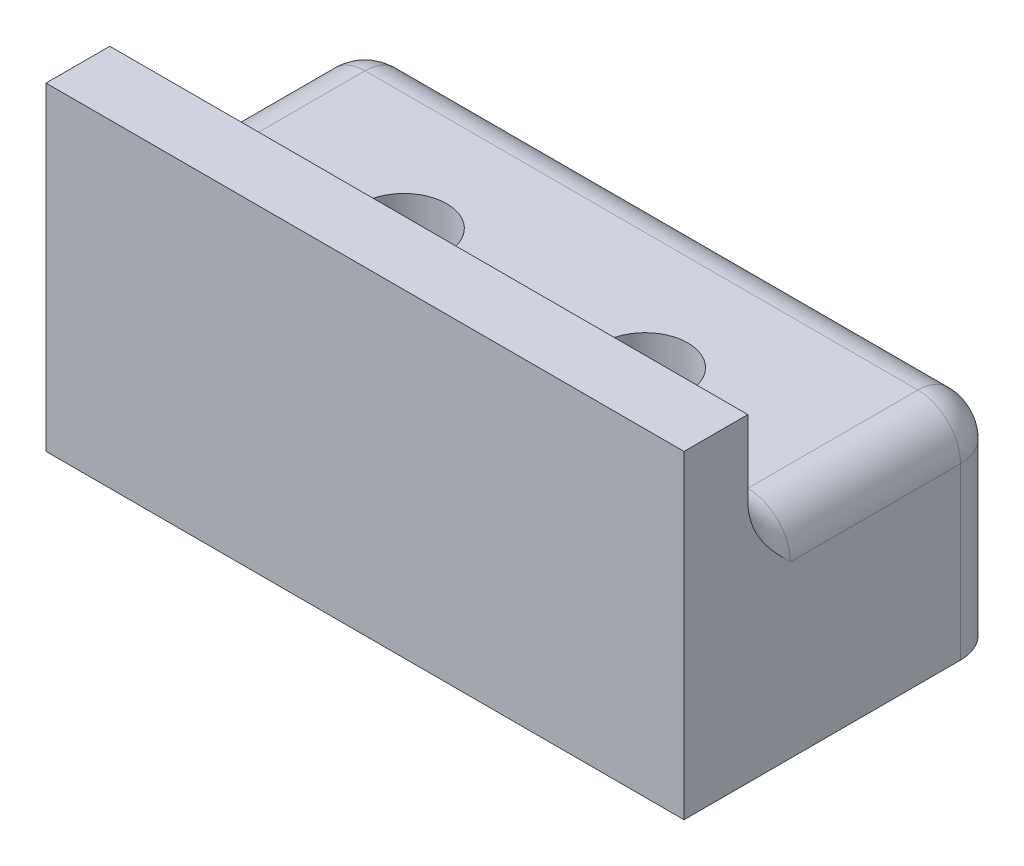
ISO-10303-21;
HEADER;
FILE_DESCRIPTION(('STEP AP214'),'2;1');
FILE_NAME('part.step','',(''),(''),'','','');
FILE_SCHEMA(('AUTOMOTIVE_DESIGN { 1 0 10303 214 1 1 1 1 }'));
ENDSEC;
DATA;
#1=APPLICATION_CONTEXT('core data for automotive mechanical design processes');
#2=APPLICATION_PROTOCOL_DEFINITION('international standard','automotive_design',2000,#1);
#3=PRODUCT_CONTEXT('',#1,'mechanical');
#4=PRODUCT('Part','Part','',(#3));
#5=PRODUCT_RELATED_PRODUCT_CATEGORY('part','',(#4));
#6=PRODUCT_DEFINITION_FORMATION('','',#4);
#7=PRODUCT_DEFINITION_CONTEXT('part definition',#1,'design');
#8=PRODUCT_DEFINITION('design','',#6,#7);
#9=PRODUCT_DEFINITION_SHAPE('','',#8);
#10=(LENGTH_UNIT() NAMED_UNIT(*) SI_UNIT(.MILLI.,.METRE.));
#11=(NAMED_UNIT(*) PLANE_ANGLE_UNIT() SI_UNIT($,.RADIAN.));
#12=(NAMED_UNIT(*) SI_UNIT($,.STERADIAN.) SOLID_ANGLE_UNIT());
#13=UNCERTAINTY_MEASURE_WITH_UNIT(LENGTH_MEASURE(1.E-05),#10,'distance_accuracy_value','');
#14=(GEOMETRIC_REPRESENTATION_CONTEXT(3) GLOBAL_UNCERTAINTY_ASSIGNED_CONTEXT((#13)) GLOBAL_UNIT_ASSIGNED_CONTEXT((#10,
#11,#12)) REPRESENTATION_CONTEXT('',''));
#15=CARTESIAN_POINT('',(0.,0.,0.));
#16=DIRECTION('',(0.,0.,1.));
#17=DIRECTION('',(1.,0.,0.));
#18=AXIS2_PLACEMENT_3D('',#15,#16,#17);
#19=CARTESIAN_POINT('',(0.,12.7,0.));
#20=DIRECTION('',(0.,-1.,0.));
#21=DIRECTION('',(0.,0.,-1.));
#22=AXIS2_PLACEMENT_3D('',#19,#20,#21);
#23=PLANE('',#22);
#24=DIRECTION('',(0.,0.,1.));
#25=VECTOR('',#24,1.);
#26=CARTESIAN_POINT('',(-16.51,12.7,0.));
#27=LINE('',#26,#25);
#28=CARTESIAN_POINT('',(-16.51,12.7,-6.985));
#29=VERTEX_POINT('',#28);
#30=CARTESIAN_POINT('',(-16.51,12.7,3.175));
#31=VERTEX_POINT('',#30);
#32=EDGE_CURVE('E190',#29,#31,#27,.T.);
#33=ORIENTED_EDGE('',*,*,#32,.T.);
#34=DIRECTION('',(-1.,0.,0.));
#35=VECTOR('',#34,1.);
#36=CARTESIAN_POINT('',(16.51,12.7,3.175));
#37=LINE('',#36,#35);
#38=CARTESIAN_POINT('',(16.51,12.7,3.175));
#39=VERTEX_POINT('',#38);
#40=EDGE_CURVE('E237',#31,#39,#37,.F.);
#41=ORIENTED_EDGE('',*,*,#40,.T.);
#42=DIRECTION('',(0.,0.,-1.));
#43=VECTOR('',#42,1.);
#44=CARTESIAN_POINT('',(16.51,12.7,0.));
#45=LINE('',#44,#43);
#46=CARTESIAN_POINT('',(16.51,12.7,-6.985));
#47=VERTEX_POINT('',#46);
#48=EDGE_CURVE('E192',#39,#47,#45,.T.);
#49=ORIENTED_EDGE('',*,*,#48,.T.);
#50=DIRECTION('',(-1.,0.,0.));
#51=VECTOR('',#50,1.);
#52=CARTESIAN_POINT('',(0.,12.7,-6.985));
#53=LINE('',#52,#51);
#54=EDGE_CURVE('E139',#47,#29,#53,.T.);
#55=ORIENTED_EDGE('',*,*,#54,.T.);
#56=EDGE_LOOP('',(#33,#41,#49,#55));
#57=FACE_BOUND('',#56,.T.);
#58=CARTESIAN_POINT('',(-7.2009,12.7,0.));
#59=DIRECTION('',(0.,1.,0.));
#60=DIRECTION('',(0.,0.,-1.));
#61=AXIS2_PLACEMENT_3D('',#58,#59,#60);
#62=CIRCLE('',#61,2.5527);
#63=CARTESIAN_POINT('',(-7.2009,12.7,-2.5527));
#64=VERTEX_POINT('',#63);
#65=EDGE_CURVE('E168',#64,#64,#62,.T.);
#66=ORIENTED_EDGE('',*,*,#65,.F.);
#67=EDGE_LOOP('',(#66));
#68=FACE_BOUND('',#67,.T.);
#69=CARTESIAN_POINT('',(7.2009,12.7,0.));
#70=DIRECTION('',(0.,1.,0.));
#71=DIRECTION('',(0.,0.,1.));
#72=AXIS2_PLACEMENT_3D('',#69,#70,#71);
#73=CIRCLE('',#72,2.5527);
#74=CARTESIAN_POINT('',(7.2009,12.7,2.5527));
#75=VERTEX_POINT('',#74);
#76=EDGE_CURVE('E174',#75,#75,#73,.T.);
#77=ORIENTED_EDGE('',*,*,#76,.F.);
#78=EDGE_LOOP('',(#77));
#79=FACE_BOUND('',#78,.T.);
#80=ADVANCED_FACE('F39',(#57,#68,#79),#23,.F.);
#81=CARTESIAN_POINT('',(0.,0.,0.));
#82=DIRECTION('',(0.,-1.,0.));
#83=DIRECTION('',(0.,0.,-1.));
#84=AXIS2_PLACEMENT_3D('',#81,#82,#83);
#85=PLANE('',#84);
#86=CARTESIAN_POINT('',(7.2009,0.,0.));
#87=DIRECTION('',(0.,1.,0.));
#88=DIRECTION('',(0.,0.,1.));
#89=AXIS2_PLACEMENT_3D('',#86,#87,#88);
#90=CIRCLE('',#89,2.5527);
#91=CARTESIAN_POINT('',(7.2009,0.,2.5527));
#92=VERTEX_POINT('',#91);
#93=EDGE_CURVE('E171',#92,#92,#90,.T.);
#94=ORIENTED_EDGE('',*,*,#93,.T.);
#95=EDGE_LOOP('',(#94));
#96=FACE_BOUND('',#95,.T.);
#97=DIRECTION('',(0.,0.,1.));
#98=VECTOR('',#97,1.);
#99=CARTESIAN_POINT('',(-19.05,0.,9.525));
#100=LINE('',#99,#98);
#101=CARTESIAN_POINT('',(-19.05,0.,-6.98499999999999));
#102=VERTEX_POINT('',#101);
#103=CARTESIAN_POINT('',(-19.05,0.,9.525));
#104=VERTEX_POINT('',#103);
#105=EDGE_CURVE('E136',#102,#104,#100,.T.);
#106=ORIENTED_EDGE('',*,*,#105,.F.);
#107=CARTESIAN_POINT('',(-16.51,0.,-6.985));
#108=DIRECTION('',(0.,-1.,0.));
#109=DIRECTION('',(0.,0.,-1.));
#110=AXIS2_PLACEMENT_3D('',#107,#108,#109);
#111=CIRCLE('',#110,2.54);
#112=CARTESIAN_POINT('',(-16.51,0.,-9.525));
#113=VERTEX_POINT('',#112);
#114=EDGE_CURVE('E205',#102,#113,#111,.T.);
#115=ORIENTED_EDGE('',*,*,#114,.T.);
#116=DIRECTION('',(-1.,0.,0.));
#117=VECTOR('',#116,1.);
#118=CARTESIAN_POINT('',(-19.05,0.,-9.525));
#119=LINE('',#118,#117);
#120=CARTESIAN_POINT('',(16.51,0.,-9.525));
#121=VERTEX_POINT('',#120);
#122=EDGE_CURVE('E182',#121,#113,#119,.T.);
#123=ORIENTED_EDGE('',*,*,#122,.F.);
#124=CARTESIAN_POINT('',(16.51,0.,-6.985));
#125=DIRECTION('',(0.,-1.,0.));
#126=DIRECTION('',(0.,0.,-1.));
#127=AXIS2_PLACEMENT_3D('',#124,#125,#126);
#128=CIRCLE('',#127,2.54);
#129=CARTESIAN_POINT('',(19.05,0.,-6.98499999999999));
#130=VERTEX_POINT('',#129);
#131=EDGE_CURVE('E203',#121,#130,#128,.T.);
#132=ORIENTED_EDGE('',*,*,#131,.T.);
#133=DIRECTION('',(0.,0.,-1.));
#134=VECTOR('',#133,1.);
#135=CARTESIAN_POINT('',(19.05,0.,9.525));
#136=LINE('',#135,#134);
#137=CARTESIAN_POINT('',(19.05,0.,9.525));
#138=VERTEX_POINT('',#137);
#139=EDGE_CURVE('E177',#138,#130,#136,.T.);
#140=ORIENTED_EDGE('',*,*,#139,.F.);
#141=DIRECTION('',(1.,0.,0.));
#142=VECTOR('',#141,1.);
#143=CARTESIAN_POINT('',(-19.05,0.,9.525));
#144=LINE('',#143,#142);
#145=EDGE_CURVE('E186',#104,#138,#144,.T.);
#146=ORIENTED_EDGE('',*,*,#145,.F.);
#147=EDGE_LOOP('',(#106,#115,#123,#132,#140,#146));
#148=FACE_BOUND('',#147,.T.);
#149=CARTESIAN_POINT('',(-7.2009,0.,0.));
#150=DIRECTION('',(0.,1.,0.));
#151=DIRECTION('',(0.,0.,-1.));
#152=AXIS2_PLACEMENT_3D('',#149,#150,#151);
#153=CIRCLE('',#152,2.5527);
#154=CARTESIAN_POINT('',(-7.2009,0.,-2.5527));
#155=VERTEX_POINT('',#154);
#156=EDGE_CURVE('E167',#155,#155,#153,.T.);
#157=ORIENTED_EDGE('',*,*,#156,.T.);
#158=EDGE_LOOP('',(#157));
#159=FACE_BOUND('',#158,.T.);
#160=ADVANCED_FACE('F259',(#96,#148,#159),#85,.T.);
#161=CARTESIAN_POINT('',(19.05,12.7,9.525));
#162=DIRECTION('',(-1.,0.,0.));
#163=DIRECTION('',(0.,0.,1.));
#164=AXIS2_PLACEMENT_3D('',#161,#162,#163);
#165=PLANE('',#164);
#166=DIRECTION('',(0.,0.,-1.));
#167=VECTOR('',#166,1.);
#168=CARTESIAN_POINT('',(19.05,10.16,9.525));
#169=LINE('',#168,#167);
#170=CARTESIAN_POINT('',(19.05,10.16,-6.985));
#171=VERTEX_POINT('',#170);
#172=CARTESIAN_POINT('',(19.05,10.16,3.175));
#173=VERTEX_POINT('',#172);
#174=EDGE_CURVE('E196',#171,#173,#169,.F.);
#175=ORIENTED_EDGE('',*,*,#174,.T.);
#176=CARTESIAN_POINT('',(19.05,14.5594090512249,5.715));
#177=CARTESIAN_POINT('',(19.05,14.4505759874427,5.71501504876247));
#178=CARTESIAN_POINT('',(19.05,14.3418065232302,5.70975624543979));
#179=CARTESIAN_POINT('',(19.05,14.1253476567874,5.68941322800302));
#180=CARTESIAN_POINT('',(19.05,14.0176568637444,5.67434396617409));
#181=CARTESIAN_POINT('',(19.05,13.8052595388879,5.63533444604275));
#182=CARTESIAN_POINT('',(19.05,13.7005326849799,5.61150324095517));
#183=CARTESIAN_POINT('',(19.05,13.4932406471553,5.55569268019696));
#184=CARTESIAN_POINT('',(19.05,13.3906765212546,5.52370943224836));
#185=CARTESIAN_POINT('',(19.05,13.1505102847445,5.43909624670696));
#186=CARTESIAN_POINT('',(19.05,13.0140509102258,5.38321046532352));
#187=CARTESIAN_POINT('',(19.05,12.7465998736406,5.25951996810727));
#188=CARTESIAN_POINT('',(19.05,12.6156126892767,5.19170571919607));
#189=CARTESIAN_POINT('',(19.05,12.230098360125,4.97263734949868));
#190=CARTESIAN_POINT('',(19.05,11.9841881684873,4.8061998794252));
#191=CARTESIAN_POINT('',(19.05,11.4639726646023,4.41027580909795));
#192=CARTESIAN_POINT('',(19.05,11.1943668281642,4.17487297354857));
#193=CARTESIAN_POINT('',(19.05,10.6721911833007,3.6870318111219));
#194=CARTESIAN_POINT('',(19.05,10.4196083228355,3.43460683970978));
#195=CARTESIAN_POINT('',(19.05,10.1647516058492,3.17975160571443));
#196=CARTESIAN_POINT('',(19.05,10.1623758018692,3.17737580170878));
#197=CARTESIAN_POINT('',(19.05,10.16,3.175));
#198=B_SPLINE_CURVE_WITH_KNOTS('',3,(#176,#177,#178,#179,#180,#181,#182,#183,#184,#185,#186,
#187,#188,#189,#190,#191,#192,#193,#194,#195,#196,#197),.UNSPECIFIED.,.F.,.F.,(4,2,2,2,2,2,2,2,
2,2,4),(0.,0.326279030100379,0.652061933370734,0.973920224726877,1.2959324794988,
1.73760545667784,2.17963303041169,3.06739378455278,4.13940698375844,5.2105886598945,
5.22066834243601),.UNSPECIFIED.);
#199=CARTESIAN_POINT('',(19.05,14.5594090512249,5.715));
#200=VERTEX_POINT('',#199);
#201=EDGE_CURVE('E49',#173,#200,#198,.F.);
#202=ORIENTED_EDGE('',*,*,#201,.T.);
#203=DIRECTION('',(0.,-1.,0.));
#204=VECTOR('',#203,1.);
#205=CARTESIAN_POINT('',(19.05,19.05,5.715));
#206=LINE('',#205,#204);
#207=CARTESIAN_POINT('',(19.05,19.05,5.715));
#208=VERTEX_POINT('',#207);
#209=EDGE_CURVE('E164',#208,#200,#206,.T.);
#210=ORIENTED_EDGE('',*,*,#209,.F.);
#211=DIRECTION('',(0.,0.,-1.));
#212=VECTOR('',#211,1.);
#213=CARTESIAN_POINT('',(19.05,19.05,5.715));
#214=LINE('',#213,#212);
#215=CARTESIAN_POINT('',(19.05,19.05,9.525));
#216=VERTEX_POINT('',#215);
#217=EDGE_CURVE('E148',#216,#208,#214,.T.);
#218=ORIENTED_EDGE('',*,*,#217,.F.);
#219=DIRECTION('',(0.,-1.,0.));
#220=VECTOR('',#219,1.);
#221=CARTESIAN_POINT('',(19.05,12.7,9.525));
#222=LINE('',#221,#220);
#223=EDGE_CURVE('E140',#216,#138,#222,.T.);
#224=ORIENTED_EDGE('',*,*,#223,.T.);
#225=ORIENTED_EDGE('',*,*,#139,.T.);
#226=DIRECTION('',(0.,-1.,0.));
#227=VECTOR('',#226,1.);
#228=CARTESIAN_POINT('',(19.05,12.7,-6.985));
#229=LINE('',#228,#227);
#230=EDGE_CURVE('E194',#130,#171,#229,.F.);
#231=ORIENTED_EDGE('',*,*,#230,.T.);
#232=EDGE_LOOP('',(#175,#202,#210,#218,#224,#225,#231));
#233=FACE_BOUND('',#232,.T.);
#234=ADVANCED_FACE('F253',(#233),#165,.F.);
#235=CARTESIAN_POINT('',(-19.05,12.7,-9.525));
#236=DIRECTION('',(0.,0.,1.));
#237=DIRECTION('',(1.,0.,0.));
#238=AXIS2_PLACEMENT_3D('',#235,#236,#237);
#239=PLANE('',#238);
#240=ORIENTED_EDGE('',*,*,#122,.T.);
#241=DIRECTION('',(0.,-1.,0.));
#242=VECTOR('',#241,1.);
#243=CARTESIAN_POINT('',(-16.51,12.7,-9.525));
#244=LINE('',#243,#242);
#245=CARTESIAN_POINT('',(-16.51,10.16,-9.525));
#246=VERTEX_POINT('',#245);
#247=EDGE_CURVE('E211',#113,#246,#244,.F.);
#248=ORIENTED_EDGE('',*,*,#247,.T.);
#249=DIRECTION('',(-1.,0.,0.));
#250=VECTOR('',#249,1.);
#251=CARTESIAN_POINT('',(-19.05,10.16,-9.525));
#252=LINE('',#251,#250);
#253=CARTESIAN_POINT('',(16.51,10.16,-9.525));
#254=VERTEX_POINT('',#253);
#255=EDGE_CURVE('E207',#246,#254,#252,.F.);
#256=ORIENTED_EDGE('',*,*,#255,.T.);
#257=DIRECTION('',(0.,-1.,0.));
#258=VECTOR('',#257,1.);
#259=CARTESIAN_POINT('',(16.51,12.7,-9.525));
#260=LINE('',#259,#258);
#261=EDGE_CURVE('E209',#254,#121,#260,.T.);
#262=ORIENTED_EDGE('',*,*,#261,.T.);
#263=EDGE_LOOP('',(#240,#248,#256,#262));
#264=FACE_BOUND('',#263,.T.);
#265=ADVANCED_FACE('F258',(#264),#239,.F.);
#266=CARTESIAN_POINT('',(-19.05,12.7,9.525));
#267=DIRECTION('',(1.,0.,0.));
#268=DIRECTION('',(0.,0.,-1.));
#269=AXIS2_PLACEMENT_3D('',#266,#267,#268);
#270=PLANE('',#269);
#271=DIRECTION('',(0.,-1.,0.));
#272=VECTOR('',#271,1.);
#273=CARTESIAN_POINT('',(-19.05,19.05,5.715));
#274=LINE('',#273,#272);
#275=CARTESIAN_POINT('',(-19.05,19.05,5.715));
#276=VERTEX_POINT('',#275);
#277=CARTESIAN_POINT('',(-19.05,14.5594090512249,5.715));
#278=VERTEX_POINT('',#277);
#279=EDGE_CURVE('E162',#276,#278,#274,.T.);
#280=ORIENTED_EDGE('',*,*,#279,.T.);
#281=CARTESIAN_POINT('',(-19.05,14.5594090512249,5.715));
#282=CARTESIAN_POINT('',(-19.05,14.4505759874427,5.71501504876247));
#283=CARTESIAN_POINT('',(-19.05,14.3418065232302,5.70975624543979));
#284=CARTESIAN_POINT('',(-19.05,14.1253476567874,5.68941322800302));
#285=CARTESIAN_POINT('',(-19.05,14.0176568637444,5.67434396617409));
#286=CARTESIAN_POINT('',(-19.05,13.8052595388879,5.63533444604275));
#287=CARTESIAN_POINT('',(-19.05,13.7005326849799,5.61150324095517));
#288=CARTESIAN_POINT('',(-19.05,13.4932406471553,5.55569268019696));
#289=CARTESIAN_POINT('',(-19.05,13.3906765212546,5.52370943224836));
#290=CARTESIAN_POINT('',(-19.05,13.1505102847445,5.43909624670696));
#291=CARTESIAN_POINT('',(-19.05,13.0140509102258,5.38321046532352));
#292=CARTESIAN_POINT('',(-19.05,12.7465998736406,5.25951996810727));
#293=CARTESIAN_POINT('',(-19.05,12.6156126892767,5.19170571919607));
#294=CARTESIAN_POINT('',(-19.05,12.230098360125,4.97263734949868));
#295=CARTESIAN_POINT('',(-19.05,11.9841881684873,4.8061998794252));
#296=CARTESIAN_POINT('',(-19.05,11.4639726646023,4.41027580909795));
#297=CARTESIAN_POINT('',(-19.05,11.1943668281642,4.17487297354857));
#298=CARTESIAN_POINT('',(-19.05,10.6721911833007,3.6870318111219));
#299=CARTESIAN_POINT('',(-19.05,10.4196083228355,3.43460683970978));
#300=CARTESIAN_POINT('',(-19.05,10.1647516058492,3.17975160571443));
#301=CARTESIAN_POINT('',(-19.05,10.1623758018692,3.17737580170878));
#302=CARTESIAN_POINT('',(-19.05,10.16,3.175));
#303=B_SPLINE_CURVE_WITH_KNOTS('',3,(#281,#282,#283,#284,#285,#286,#287,#288,#289,#290,#291,
#292,#293,#294,#295,#296,#297,#298,#299,#300,#301,#302),.UNSPECIFIED.,.F.,.F.,(4,2,2,2,2,2,2,2,
2,2,4),(0.,0.326279030100379,0.652061933370734,0.973920224726877,1.2959324794988,
1.73760545667784,2.17963303041169,3.06739378455278,4.13940698375844,5.2105886598945,
5.22066834243601),.UNSPECIFIED.);
#304=CARTESIAN_POINT('',(-19.05,10.16,3.175));
#305=VERTEX_POINT('',#304);
#306=EDGE_CURVE('E11',#278,#305,#303,.T.);
#307=ORIENTED_EDGE('',*,*,#306,.T.);
#308=DIRECTION('',(0.,0.,1.));
#309=VECTOR('',#308,1.);
#310=CARTESIAN_POINT('',(-19.05,10.16,9.525));
#311=LINE('',#310,#309);
#312=CARTESIAN_POINT('',(-19.05,10.16,-6.985));
#313=VERTEX_POINT('',#312);
#314=EDGE_CURVE('E201',#305,#313,#311,.F.);
#315=ORIENTED_EDGE('',*,*,#314,.T.);
#316=DIRECTION('',(0.,-1.,0.));
#317=VECTOR('',#316,1.);
#318=CARTESIAN_POINT('',(-19.05,12.7,-6.985));
#319=LINE('',#318,#317);
#320=EDGE_CURVE('E199',#313,#102,#319,.T.);
#321=ORIENTED_EDGE('',*,*,#320,.T.);
#322=ORIENTED_EDGE('',*,*,#105,.T.);
#323=DIRECTION('',(0.,-1.,0.));
#324=VECTOR('',#323,1.);
#325=CARTESIAN_POINT('',(-19.05,12.7,9.525));
#326=LINE('',#325,#324);
#327=CARTESIAN_POINT('',(-19.05,19.05,9.525));
#328=VERTEX_POINT('',#327);
#329=EDGE_CURVE('E130',#328,#104,#326,.T.);
#330=ORIENTED_EDGE('',*,*,#329,.F.);
#331=DIRECTION('',(0.,0.,1.));
#332=VECTOR('',#331,1.);
#333=CARTESIAN_POINT('',(-19.05,19.05,5.715));
#334=LINE('',#333,#332);
#335=EDGE_CURVE('E134',#276,#328,#334,.T.);
#336=ORIENTED_EDGE('',*,*,#335,.F.);
#337=EDGE_LOOP('',(#280,#307,#315,#321,#322,#330,#336));
#338=FACE_BOUND('',#337,.T.);
#339=ADVANCED_FACE('F132',(#338),#270,.F.);
#340=CARTESIAN_POINT('',(-19.05,12.7,9.525));
#341=DIRECTION('',(0.,0.,-1.));
#342=DIRECTION('',(-1.,0.,0.));
#343=AXIS2_PLACEMENT_3D('',#340,#341,#342);
#344=PLANE('',#343);
#345=ORIENTED_EDGE('',*,*,#145,.T.);
#346=ORIENTED_EDGE('',*,*,#223,.F.);
#347=DIRECTION('',(1.,0.,0.));
#348=VECTOR('',#347,1.);
#349=CARTESIAN_POINT('',(-19.05,19.05,9.525));
#350=LINE('',#349,#348);
#351=EDGE_CURVE('E143',#328,#216,#350,.T.);
#352=ORIENTED_EDGE('',*,*,#351,.F.);
#353=ORIENTED_EDGE('',*,*,#329,.T.);
#354=EDGE_LOOP('',(#345,#346,#352,#353));
#355=FACE_BOUND('',#354,.T.);
#356=ADVANCED_FACE('F144',(#355),#344,.F.);
#357=CARTESIAN_POINT('',(7.2009,12.7,0.));
#358=DIRECTION('',(0.,-1.,0.));
#359=DIRECTION('',(0.,0.,-1.));
#360=AXIS2_PLACEMENT_3D('',#357,#358,#359);
#361=CYLINDRICAL_SURFACE('',#360,2.5527);
#362=ORIENTED_EDGE('',*,*,#76,.T.);
#363=EDGE_LOOP('',(#362));
#364=FACE_BOUND('',#363,.T.);
#365=ORIENTED_EDGE('',*,*,#93,.F.);
#366=EDGE_LOOP('',(#365));
#367=FACE_BOUND('',#366,.T.);
#368=ADVANCED_FACE('F301',(#364,#367),#361,.F.);
#369=CARTESIAN_POINT('',(-7.2009,12.7,0.));
#370=DIRECTION('',(0.,-1.,0.));
#371=DIRECTION('',(0.,0.,-1.));
#372=AXIS2_PLACEMENT_3D('',#369,#370,#371);
#373=CYLINDRICAL_SURFACE('',#372,2.5527);
#374=ORIENTED_EDGE('',*,*,#65,.T.);
#375=EDGE_LOOP('',(#374));
#376=FACE_BOUND('',#375,.T.);
#377=ORIENTED_EDGE('',*,*,#156,.F.);
#378=EDGE_LOOP('',(#377));
#379=FACE_BOUND('',#378,.T.);
#380=ADVANCED_FACE('F421',(#376,#379),#373,.F.);
#381=CARTESIAN_POINT('',(-19.05,19.05,5.715));
#382=DIRECTION('',(0.,0.,1.));
#383=DIRECTION('',(1.,0.,0.));
#384=AXIS2_PLACEMENT_3D('',#381,#382,#383);
#385=PLANE('',#384);
#386=ORIENTED_EDGE('',*,*,#209,.T.);
#387=CARTESIAN_POINT('',(16.51,10.16,5.715));
#388=DIRECTION('',(0.,0.,1.));
#389=DIRECTION('',(1.,0.,0.));
#390=AXIS2_PLACEMENT_3D('',#387,#388,#389);
#391=CIRCLE('',#390,5.08);
#392=CARTESIAN_POINT('',(16.51,15.24,5.715));
#393=VERTEX_POINT('',#392);
#394=EDGE_CURVE('E231',#200,#393,#391,.T.);
#395=ORIENTED_EDGE('',*,*,#394,.T.);
#396=DIRECTION('',(-1.,0.,0.));
#397=VECTOR('',#396,1.);
#398=CARTESIAN_POINT('',(-16.51,15.24,5.715));
#399=LINE('',#398,#397);
#400=CARTESIAN_POINT('',(-16.51,15.24,5.715));
#401=VERTEX_POINT('',#400);
#402=EDGE_CURVE('E213',#393,#401,#399,.T.);
#403=ORIENTED_EDGE('',*,*,#402,.T.);
#404=CARTESIAN_POINT('',(-16.51,10.16,5.715));
#405=DIRECTION('',(0.,0.,1.));
#406=DIRECTION('',(1.,0.,0.));
#407=AXIS2_PLACEMENT_3D('',#404,#405,#406);
#408=CIRCLE('',#407,5.08);
#409=EDGE_CURVE('E229',#401,#278,#408,.T.);
#410=ORIENTED_EDGE('',*,*,#409,.T.);
#411=ORIENTED_EDGE('',*,*,#279,.F.);
#412=DIRECTION('',(-1.,0.,0.));
#413=VECTOR('',#412,1.);
#414=CARTESIAN_POINT('',(-19.05,19.05,5.715));
#415=LINE('',#414,#413);
#416=EDGE_CURVE('E152',#208,#276,#415,.T.);
#417=ORIENTED_EDGE('',*,*,#416,.F.);
#418=EDGE_LOOP('',(#386,#395,#403,#410,#411,#417));
#419=FACE_BOUND('',#418,.T.);
#420=ADVANCED_FACE('F289',(#419),#385,.F.);
#421=CARTESIAN_POINT('',(0.,19.05,0.));
#422=DIRECTION('',(0.,1.,0.));
#423=DIRECTION('',(0.,0.,1.));
#424=AXIS2_PLACEMENT_3D('',#421,#422,#423);
#425=PLANE('',#424);
#426=ORIENTED_EDGE('',*,*,#335,.T.);
#427=ORIENTED_EDGE('',*,*,#351,.T.);
#428=ORIENTED_EDGE('',*,*,#217,.T.);
#429=ORIENTED_EDGE('',*,*,#416,.T.);
#430=EDGE_LOOP('',(#426,#427,#428,#429));
#431=FACE_BOUND('',#430,.T.);
#432=ADVANCED_FACE('F150',(#431),#425,.T.);
#433=CARTESIAN_POINT('',(-16.51,10.16,0.));
#434=DIRECTION('',(0.,0.,1.));
#435=DIRECTION('',(1.,0.,0.));
#436=AXIS2_PLACEMENT_3D('',#433,#434,#435);
#437=CYLINDRICAL_SURFACE('',#436,2.54);
#438=ORIENTED_EDGE('',*,*,#314,.F.);
#439=CARTESIAN_POINT('',(-16.51,10.16,3.175));
#440=DIRECTION('',(0.,0.,1.));
#441=DIRECTION('',(1.,0.,0.));
#442=AXIS2_PLACEMENT_3D('',#439,#440,#441);
#443=CIRCLE('',#442,2.54);
#444=EDGE_CURVE('E62',#305,#31,#443,.F.);
#445=ORIENTED_EDGE('',*,*,#444,.T.);
#446=ORIENTED_EDGE('',*,*,#32,.F.);
#447=CARTESIAN_POINT('',(-16.51,10.16,-6.985));
#448=DIRECTION('',(0.,0.,-1.));
#449=DIRECTION('',(-1.,0.,0.));
#450=AXIS2_PLACEMENT_3D('',#447,#448,#449);
#451=CIRCLE('',#450,2.54);
#452=EDGE_CURVE('E154',#313,#29,#451,.T.);
#453=ORIENTED_EDGE('',*,*,#452,.F.);
#454=EDGE_LOOP('',(#438,#445,#446,#453));
#455=FACE_BOUND('',#454,.T.);
#456=ADVANCED_FACE('F283',(#455),#437,.T.);
#457=CARTESIAN_POINT('',(-16.51,12.7,-6.985));
#458=DIRECTION('',(0.,-1.,0.));
#459=DIRECTION('',(0.,0.,-1.));
#460=AXIS2_PLACEMENT_3D('',#457,#458,#459);
#461=CYLINDRICAL_SURFACE('',#460,2.54);
#462=ORIENTED_EDGE('',*,*,#114,.F.);
#463=ORIENTED_EDGE('',*,*,#320,.F.);
#464=CARTESIAN_POINT('',(-16.51,10.16,-6.985));
#465=DIRECTION('',(0.,1.,0.));
#466=DIRECTION('',(0.,0.,1.));
#467=AXIS2_PLACEMENT_3D('',#464,#465,#466);
#468=CIRCLE('',#467,2.54);
#469=EDGE_CURVE('E157',#246,#313,#468,.T.);
#470=ORIENTED_EDGE('',*,*,#469,.F.);
#471=ORIENTED_EDGE('',*,*,#247,.F.);
#472=EDGE_LOOP('',(#462,#463,#470,#471));
#473=FACE_BOUND('',#472,.T.);
#474=ADVANCED_FACE('F280',(#473),#461,.T.);
#475=CARTESIAN_POINT('',(-16.51,10.16,-6.985));
#476=DIRECTION('',(-1.,0.,0.));
#477=DIRECTION('',(0.,0.,1.));
#478=AXIS2_PLACEMENT_3D('',#475,#476,#477);
#479=SPHERICAL_SURFACE('',#478,2.54);
#480=ORIENTED_EDGE('',*,*,#469,.T.);
#481=ORIENTED_EDGE('',*,*,#452,.T.);
#482=CARTESIAN_POINT('',(-16.51,10.16,-6.985));
#483=DIRECTION('',(-1.,0.,0.));
#484=DIRECTION('',(0.,0.,1.));
#485=AXIS2_PLACEMENT_3D('',#482,#483,#484);
#486=CIRCLE('',#485,2.54);
#487=EDGE_CURVE('E223',#246,#29,#486,.F.);
#488=ORIENTED_EDGE('',*,*,#487,.F.);
#489=EDGE_LOOP('',(#480,#481,#488));
#490=FACE_BOUND('',#489,.T.);
#491=ADVANCED_FACE('F276',(#490),#479,.T.);
#492=CARTESIAN_POINT('',(0.,10.16,-6.985));
#493=DIRECTION('',(-1.,0.,0.));
#494=DIRECTION('',(0.,0.,1.));
#495=AXIS2_PLACEMENT_3D('',#492,#493,#494);
#496=CYLINDRICAL_SURFACE('',#495,2.54);
#497=ORIENTED_EDGE('',*,*,#487,.T.);
#498=ORIENTED_EDGE('',*,*,#54,.F.);
#499=CARTESIAN_POINT('',(16.51,10.16,-6.985));
#500=DIRECTION('',(1.,0.,0.));
#501=DIRECTION('',(0.,0.,-1.));
#502=AXIS2_PLACEMENT_3D('',#499,#500,#501);
#503=CIRCLE('',#502,2.54);
#504=EDGE_CURVE('E220',#254,#47,#503,.T.);
#505=ORIENTED_EDGE('',*,*,#504,.F.);
#506=ORIENTED_EDGE('',*,*,#255,.F.);
#507=EDGE_LOOP('',(#497,#498,#505,#506));
#508=FACE_BOUND('',#507,.T.);
#509=ADVANCED_FACE('F272',(#508),#496,.T.);
#510=CARTESIAN_POINT('',(16.51,12.7,-6.985));
#511=DIRECTION('',(0.,-1.,0.));
#512=DIRECTION('',(0.,0.,-1.));
#513=AXIS2_PLACEMENT_3D('',#510,#511,#512);
#514=CYLINDRICAL_SURFACE('',#513,2.54);
#515=ORIENTED_EDGE('',*,*,#131,.F.);
#516=ORIENTED_EDGE('',*,*,#261,.F.);
#517=CARTESIAN_POINT('',(16.51,10.16,-6.985));
#518=DIRECTION('',(0.,1.,0.));
#519=DIRECTION('',(0.,0.,1.));
#520=AXIS2_PLACEMENT_3D('',#517,#518,#519);
#521=CIRCLE('',#520,2.54);
#522=EDGE_CURVE('E217',#171,#254,#521,.T.);
#523=ORIENTED_EDGE('',*,*,#522,.F.);
#524=ORIENTED_EDGE('',*,*,#230,.F.);
#525=EDGE_LOOP('',(#515,#516,#523,#524));
#526=FACE_BOUND('',#525,.T.);
#527=ADVANCED_FACE('F268',(#526),#514,.T.);
#528=CARTESIAN_POINT('',(16.51,10.16,-6.985));
#529=DIRECTION('',(0.,0.,-1.));
#530=DIRECTION('',(-1.,0.,0.));
#531=AXIS2_PLACEMENT_3D('',#528,#529,#530);
#532=SPHERICAL_SURFACE('',#531,2.54);
#533=ORIENTED_EDGE('',*,*,#522,.T.);
#534=ORIENTED_EDGE('',*,*,#504,.T.);
#535=CARTESIAN_POINT('',(16.51,10.16,-6.985));
#536=DIRECTION('',(0.,0.,-1.));
#537=DIRECTION('',(-1.,0.,0.));
#538=AXIS2_PLACEMENT_3D('',#535,#536,#537);
#539=CIRCLE('',#538,2.54);
#540=EDGE_CURVE('E214',#171,#47,#539,.F.);
#541=ORIENTED_EDGE('',*,*,#540,.F.);
#542=EDGE_LOOP('',(#533,#534,#541));
#543=FACE_BOUND('',#542,.T.);
#544=ADVANCED_FACE('F264',(#543),#532,.T.);
#545=CARTESIAN_POINT('',(16.51,10.16,0.));
#546=DIRECTION('',(0.,0.,-1.));
#547=DIRECTION('',(-1.,0.,0.));
#548=AXIS2_PLACEMENT_3D('',#545,#546,#547);
#549=CYLINDRICAL_SURFACE('',#548,2.54);
#550=ORIENTED_EDGE('',*,*,#48,.F.);
#551=CARTESIAN_POINT('',(16.51,10.16,3.175));
#552=DIRECTION('',(0.,0.,1.));
#553=DIRECTION('',(1.,0.,0.));
#554=AXIS2_PLACEMENT_3D('',#551,#552,#553);
#555=CIRCLE('',#554,2.54);
#556=EDGE_CURVE('E234',#39,#173,#555,.F.);
#557=ORIENTED_EDGE('',*,*,#556,.T.);
#558=ORIENTED_EDGE('',*,*,#174,.F.);
#559=ORIENTED_EDGE('',*,*,#540,.T.);
#560=EDGE_LOOP('',(#550,#557,#558,#559));
#561=FACE_BOUND('',#560,.T.);
#562=ADVANCED_FACE('F261',(#561),#549,.T.);
#563=CARTESIAN_POINT('',(-16.51,10.16,3.175));
#564=DIRECTION('',(0.,0.,1.));
#565=DIRECTION('',(1.,0.,0.));
#566=AXIS2_PLACEMENT_3D('',#563,#564,#565);
#567=TOROIDAL_SURFACE('',#566,5.08,2.54);
#568=ORIENTED_EDGE('',*,*,#306,.F.);
#569=ORIENTED_EDGE('',*,*,#409,.F.);
#570=CARTESIAN_POINT('',(-16.51,15.24,3.175));
#571=DIRECTION('',(-1.,0.,0.));
#572=DIRECTION('',(0.,0.,1.));
#573=AXIS2_PLACEMENT_3D('',#570,#571,#572);
#574=CIRCLE('',#573,2.54);
#575=EDGE_CURVE('E44',#31,#401,#574,.T.);
#576=ORIENTED_EDGE('',*,*,#575,.F.);
#577=ORIENTED_EDGE('',*,*,#444,.F.);
#578=EDGE_LOOP('',(#568,#569,#576,#577));
#579=FACE_BOUND('',#578,.T.);
#580=ADVANCED_FACE('F41',(#579),#567,.F.);
#581=CARTESIAN_POINT('',(-19.05,15.24,3.175));
#582=DIRECTION('',(1.,0.,0.));
#583=DIRECTION('',(0.,0.,-1.));
#584=AXIS2_PLACEMENT_3D('',#581,#582,#583);
#585=CYLINDRICAL_SURFACE('',#584,2.54);
#586=ORIENTED_EDGE('',*,*,#575,.T.);
#587=ORIENTED_EDGE('',*,*,#402,.F.);
#588=CARTESIAN_POINT('',(16.51,15.24,3.175));
#589=DIRECTION('',(-1.,0.,0.));
#590=DIRECTION('',(0.,0.,1.));
#591=AXIS2_PLACEMENT_3D('',#588,#589,#590);
#592=CIRCLE('',#591,2.54);
#593=EDGE_CURVE('E342',#39,#393,#592,.T.);
#594=ORIENTED_EDGE('',*,*,#593,.F.);
#595=ORIENTED_EDGE('',*,*,#40,.F.);
#596=EDGE_LOOP('',(#586,#587,#594,#595));
#597=FACE_BOUND('',#596,.T.);
#598=ADVANCED_FACE('F344',(#597),#585,.F.);
#599=CARTESIAN_POINT('',(16.51,10.16,3.175));
#600=DIRECTION('',(0.,0.,1.));
#601=DIRECTION('',(1.,0.,0.));
#602=AXIS2_PLACEMENT_3D('',#599,#600,#601);
#603=TOROIDAL_SURFACE('',#602,5.08,2.54);
#604=ORIENTED_EDGE('',*,*,#201,.F.);
#605=ORIENTED_EDGE('',*,*,#556,.F.);
#606=ORIENTED_EDGE('',*,*,#593,.T.);
#607=ORIENTED_EDGE('',*,*,#394,.F.);
#608=EDGE_LOOP('',(#604,#605,#606,#607));
#609=FACE_BOUND('',#608,.T.);
#610=ADVANCED_FACE('F250',(#609),#603,.F.);
#611=CLOSED_SHELL('',(#80,#160,#234,#265,#339,#356,#368,#380,#420,#432,#456,#474,#491,#509,#527,
#544,#562,#580,#598,#610));
#612=MANIFOLD_SOLID_BREP('B2',#611);
#613=ADVANCED_BREP_SHAPE_REPRESENTATION('',(#18,#612),#14);
#614=SHAPE_DEFINITION_REPRESENTATION(#9,#613);
ENDSEC;
END-ISO-10303-21;
